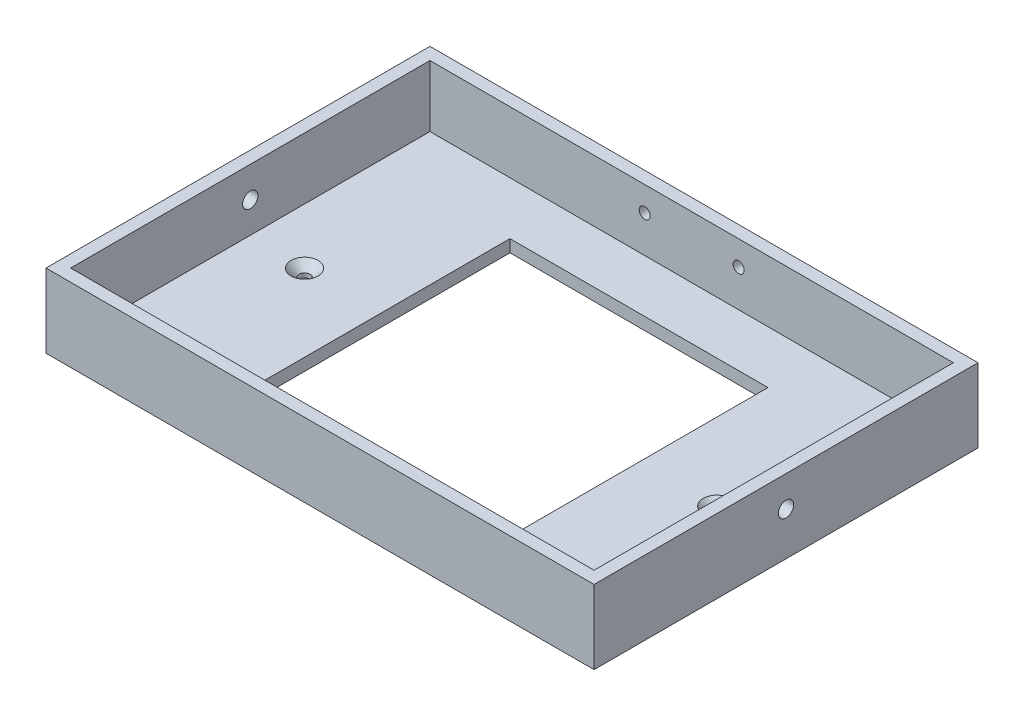
ISO-10303-21;
HEADER;
FILE_DESCRIPTION(('STEP AP214'),'2;1');
FILE_NAME('part.step','',(''),(''),'','','');
FILE_SCHEMA(('AUTOMOTIVE_DESIGN { 1 0 10303 214 1 1 1 1 }'));
ENDSEC;
DATA;
#1=APPLICATION_CONTEXT('core data for automotive mechanical design processes');
#2=APPLICATION_PROTOCOL_DEFINITION('international standard','automotive_design',2000,#1);
#3=PRODUCT_CONTEXT('',#1,'mechanical');
#4=PRODUCT('Part','Part','',(#3));
#5=PRODUCT_RELATED_PRODUCT_CATEGORY('part','',(#4));
#6=PRODUCT_DEFINITION_FORMATION('','',#4);
#7=PRODUCT_DEFINITION_CONTEXT('part definition',#1,'design');
#8=PRODUCT_DEFINITION('design','',#6,#7);
#9=PRODUCT_DEFINITION_SHAPE('','',#8);
#10=(LENGTH_UNIT() NAMED_UNIT(*) SI_UNIT(.MILLI.,.METRE.));
#11=(NAMED_UNIT(*) PLANE_ANGLE_UNIT() SI_UNIT($,.RADIAN.));
#12=(NAMED_UNIT(*) SI_UNIT($,.STERADIAN.) SOLID_ANGLE_UNIT());
#13=UNCERTAINTY_MEASURE_WITH_UNIT(LENGTH_MEASURE(1.E-05),#10,'distance_accuracy_value','');
#14=(GEOMETRIC_REPRESENTATION_CONTEXT(3) GLOBAL_UNCERTAINTY_ASSIGNED_CONTEXT((#13)) GLOBAL_UNIT_ASSIGNED_CONTEXT((#10,
#11,#12)) REPRESENTATION_CONTEXT('',''));
#15=CARTESIAN_POINT('',(0.,0.,0.));
#16=DIRECTION('',(0.,0.,1.));
#17=DIRECTION('',(1.,0.,0.));
#18=AXIS2_PLACEMENT_3D('',#15,#16,#17);
#19=CARTESIAN_POINT('',(-44.545,-2.,0.));
#20=DIRECTION('',(1.,0.,0.));
#21=DIRECTION('',(0.,0.,-1.));
#22=AXIS2_PLACEMENT_3D('',#19,#20,#21);
#23=PLANE('',#22);
#24=CARTESIAN_POINT('',(-44.545,5.,0.));
#25=DIRECTION('',(1.,0.,0.));
#26=DIRECTION('',(0.,0.,-1.));
#27=AXIS2_PLACEMENT_3D('',#24,#25,#26);
#28=CIRCLE('',#27,1.25);
#29=CARTESIAN_POINT('',(-44.545,5.,-1.25));
#30=VERTEX_POINT('',#29);
#31=EDGE_CURVE('E296',#30,#30,#28,.T.);
#32=ORIENTED_EDGE('',*,*,#31,.T.);
#33=EDGE_LOOP('',(#32));
#34=FACE_BOUND('',#33,.T.);
#35=DIRECTION('',(0.,1.,0.));
#36=VECTOR('',#35,1.);
#37=CARTESIAN_POINT('',(-44.545,-2.,31.21));
#38=LINE('',#37,#36);
#39=CARTESIAN_POINT('',(-44.545,-2.,31.21));
#40=VERTEX_POINT('',#39);
#41=CARTESIAN_POINT('',(-44.545,10.,31.21));
#42=VERTEX_POINT('',#41);
#43=EDGE_CURVE('E218',#40,#42,#38,.T.);
#44=ORIENTED_EDGE('',*,*,#43,.T.);
#45=DIRECTION('',(0.,0.,1.));
#46=VECTOR('',#45,1.);
#47=CARTESIAN_POINT('',(-44.545,10.,31.21));
#48=LINE('',#47,#46);
#49=CARTESIAN_POINT('',(-44.545,10.,-31.21));
#50=VERTEX_POINT('',#49);
#51=EDGE_CURVE('E205',#50,#42,#48,.T.);
#52=ORIENTED_EDGE('',*,*,#51,.F.);
#53=DIRECTION('',(0.,1.,0.));
#54=VECTOR('',#53,1.);
#55=CARTESIAN_POINT('',(-44.545,-2.,-31.21));
#56=LINE('',#55,#54);
#57=CARTESIAN_POINT('',(-44.545,-2.,-31.21));
#58=VERTEX_POINT('',#57);
#59=EDGE_CURVE('E12',#58,#50,#56,.T.);
#60=ORIENTED_EDGE('',*,*,#59,.F.);
#61=DIRECTION('',(0.,0.,-1.));
#62=VECTOR('',#61,1.);
#63=CARTESIAN_POINT('',(-44.545,-2.,0.));
#64=LINE('',#63,#62);
#65=EDGE_CURVE('E208',#40,#58,#64,.T.);
#66=ORIENTED_EDGE('',*,*,#65,.F.);
#67=EDGE_LOOP('',(#44,#52,#60,#66));
#68=FACE_BOUND('',#67,.T.);
#69=ADVANCED_FACE('F41',(#34,#68),#23,.F.);
#70=CARTESIAN_POINT('',(0.,-2.,-31.21));
#71=DIRECTION('',(0.,0.,1.));
#72=DIRECTION('',(1.,0.,0.));
#73=AXIS2_PLACEMENT_3D('',#70,#71,#72);
#74=PLANE('',#73);
#75=CARTESIAN_POINT('',(7.635,6.,-31.21));
#76=DIRECTION('',(0.,0.,-1.));
#77=DIRECTION('',(-1.,0.,0.));
#78=AXIS2_PLACEMENT_3D('',#75,#76,#77);
#79=CIRCLE('',#78,0.899999999999999);
#80=CARTESIAN_POINT('',(6.735,6.,-31.21));
#81=VERTEX_POINT('',#80);
#82=EDGE_CURVE('E343',#81,#81,#79,.T.);
#83=ORIENTED_EDGE('',*,*,#82,.F.);
#84=EDGE_LOOP('',(#83));
#85=FACE_BOUND('',#84,.T.);
#86=CARTESIAN_POINT('',(-7.635,6.,-31.21));
#87=DIRECTION('',(0.,0.,-1.));
#88=DIRECTION('',(-1.,0.,0.));
#89=AXIS2_PLACEMENT_3D('',#86,#87,#88);
#90=CIRCLE('',#89,0.899999999999999);
#91=CARTESIAN_POINT('',(-8.535,6.,-31.21));
#92=VERTEX_POINT('',#91);
#93=EDGE_CURVE('E344',#92,#92,#90,.T.);
#94=ORIENTED_EDGE('',*,*,#93,.F.);
#95=EDGE_LOOP('',(#94));
#96=FACE_BOUND('',#95,.T.);
#97=ORIENTED_EDGE('',*,*,#59,.T.);
#98=DIRECTION('',(-1.,0.,0.));
#99=VECTOR('',#98,1.);
#100=CARTESIAN_POINT('',(-44.545,10.,-31.21));
#101=LINE('',#100,#99);
#102=CARTESIAN_POINT('',(44.545,10.,-31.21));
#103=VERTEX_POINT('',#102);
#104=EDGE_CURVE('E202',#103,#50,#101,.T.);
#105=ORIENTED_EDGE('',*,*,#104,.F.);
#106=DIRECTION('',(0.,1.,0.));
#107=VECTOR('',#106,1.);
#108=CARTESIAN_POINT('',(44.545,-2.,-31.21));
#109=LINE('',#108,#107);
#110=CARTESIAN_POINT('',(44.545,-2.,-31.21));
#111=VERTEX_POINT('',#110);
#112=EDGE_CURVE('E49',#111,#103,#109,.T.);
#113=ORIENTED_EDGE('',*,*,#112,.F.);
#114=DIRECTION('',(1.,0.,0.));
#115=VECTOR('',#114,1.);
#116=CARTESIAN_POINT('',(0.,-2.,-31.21));
#117=LINE('',#116,#115);
#118=EDGE_CURVE('E217',#58,#111,#117,.T.);
#119=ORIENTED_EDGE('',*,*,#118,.F.);
#120=EDGE_LOOP('',(#97,#105,#113,#119));
#121=FACE_BOUND('',#120,.T.);
#122=ADVANCED_FACE('F285',(#85,#96,#121),#74,.F.);
#123=CARTESIAN_POINT('',(44.545,-2.,0.));
#124=DIRECTION('',(1.,0.,0.));
#125=DIRECTION('',(0.,0.,-1.));
#126=AXIS2_PLACEMENT_3D('',#123,#124,#125);
#127=PLANE('',#126);
#128=CARTESIAN_POINT('',(44.545,5.,0.));
#129=DIRECTION('',(1.,0.,0.));
#130=DIRECTION('',(0.,0.,-1.));
#131=AXIS2_PLACEMENT_3D('',#128,#129,#130);
#132=CIRCLE('',#131,1.25);
#133=CARTESIAN_POINT('',(44.545,5.,-1.25));
#134=VERTEX_POINT('',#133);
#135=EDGE_CURVE('E332',#134,#134,#132,.T.);
#136=ORIENTED_EDGE('',*,*,#135,.F.);
#137=EDGE_LOOP('',(#136));
#138=FACE_BOUND('',#137,.T.);
#139=ORIENTED_EDGE('',*,*,#112,.T.);
#140=DIRECTION('',(0.,0.,-1.));
#141=VECTOR('',#140,1.);
#142=CARTESIAN_POINT('',(44.545,10.,31.21));
#143=LINE('',#142,#141);
#144=CARTESIAN_POINT('',(44.545,10.,31.21));
#145=VERTEX_POINT('',#144);
#146=EDGE_CURVE('E199',#145,#103,#143,.T.);
#147=ORIENTED_EDGE('',*,*,#146,.F.);
#148=DIRECTION('',(0.,1.,0.));
#149=VECTOR('',#148,1.);
#150=CARTESIAN_POINT('',(44.545,-2.,31.21));
#151=LINE('',#150,#149);
#152=CARTESIAN_POINT('',(44.545,-2.,31.21));
#153=VERTEX_POINT('',#152);
#154=EDGE_CURVE('E220',#153,#145,#151,.T.);
#155=ORIENTED_EDGE('',*,*,#154,.F.);
#156=DIRECTION('',(0.,0.,-1.));
#157=VECTOR('',#156,1.);
#158=CARTESIAN_POINT('',(44.545,-2.,0.));
#159=LINE('',#158,#157);
#160=EDGE_CURVE('E214',#153,#111,#159,.T.);
#161=ORIENTED_EDGE('',*,*,#160,.T.);
#162=EDGE_LOOP('',(#139,#147,#155,#161));
#163=FACE_BOUND('',#162,.T.);
#164=ADVANCED_FACE('F290',(#138,#163),#127,.T.);
#165=CARTESIAN_POINT('',(0.,-2.,31.21));
#166=DIRECTION('',(0.,0.,1.));
#167=DIRECTION('',(1.,0.,0.));
#168=AXIS2_PLACEMENT_3D('',#165,#166,#167);
#169=PLANE('',#168);
#170=ORIENTED_EDGE('',*,*,#154,.T.);
#171=DIRECTION('',(1.,0.,0.));
#172=VECTOR('',#171,1.);
#173=CARTESIAN_POINT('',(-44.545,10.,31.21));
#174=LINE('',#173,#172);
#175=EDGE_CURVE('E196',#42,#145,#174,.T.);
#176=ORIENTED_EDGE('',*,*,#175,.F.);
#177=ORIENTED_EDGE('',*,*,#43,.F.);
#178=DIRECTION('',(1.,0.,0.));
#179=VECTOR('',#178,1.);
#180=CARTESIAN_POINT('',(0.,-2.,31.21));
#181=LINE('',#180,#179);
#182=EDGE_CURVE('E211',#40,#153,#181,.T.);
#183=ORIENTED_EDGE('',*,*,#182,.T.);
#184=EDGE_LOOP('',(#170,#176,#177,#183));
#185=FACE_BOUND('',#184,.T.);
#186=ADVANCED_FACE('F305',(#185),#169,.T.);
#187=CARTESIAN_POINT('',(0.,-2.,0.));
#188=DIRECTION('',(0.,1.,0.));
#189=DIRECTION('',(0.,0.,1.));
#190=AXIS2_PLACEMENT_3D('',#187,#188,#189);
#191=PLANE('',#190);
#192=DIRECTION('',(1.,0.,0.));
#193=VECTOR('',#192,1.);
#194=CARTESIAN_POINT('',(0.,-2.,20.6397148624546));
#195=LINE('',#194,#193);
#196=CARTESIAN_POINT('',(-20.9675803435516,-2.,20.6397148624546));
#197=VERTEX_POINT('',#196);
#198=CARTESIAN_POINT('',(20.9675803435516,-2.,20.6397148624546));
#199=VERTEX_POINT('',#198);
#200=EDGE_CURVE('E554',#197,#199,#195,.T.);
#201=ORIENTED_EDGE('',*,*,#200,.T.);
#202=DIRECTION('',(0.,0.,-1.));
#203=VECTOR('',#202,1.);
#204=CARTESIAN_POINT('',(20.9675803435516,-2.,0.));
#205=LINE('',#204,#203);
#206=CARTESIAN_POINT('',(20.9675803435516,-2.,-20.6397148624546));
#207=VERTEX_POINT('',#206);
#208=EDGE_CURVE('E240',#199,#207,#205,.T.);
#209=ORIENTED_EDGE('',*,*,#208,.T.);
#210=DIRECTION('',(-1.,0.,0.));
#211=VECTOR('',#210,1.);
#212=CARTESIAN_POINT('',(0.,-2.,-20.6397148624546));
#213=LINE('',#212,#211);
#214=CARTESIAN_POINT('',(-20.9675803435516,-2.,-20.6397148624546));
#215=VERTEX_POINT('',#214);
#216=EDGE_CURVE('E156',#207,#215,#213,.T.);
#217=ORIENTED_EDGE('',*,*,#216,.T.);
#218=DIRECTION('',(0.,0.,1.));
#219=VECTOR('',#218,1.);
#220=CARTESIAN_POINT('',(-20.9675803435516,-2.,0.));
#221=LINE('',#220,#219);
#222=EDGE_CURVE('E136',#215,#197,#221,.T.);
#223=ORIENTED_EDGE('',*,*,#222,.T.);
#224=EDGE_LOOP('',(#201,#209,#217,#223));
#225=FACE_BOUND('',#224,.T.);
#226=CARTESIAN_POINT('',(-33.5,-2.,0.218926060152494));
#227=DIRECTION('',(0.,1.,0.));
#228=DIRECTION('',(0.,0.,1.));
#229=AXIS2_PLACEMENT_3D('',#226,#227,#228);
#230=CIRCLE('',#229,0.899999999999995);
#231=CARTESIAN_POINT('',(-33.5,-2.,1.11892606015249));
#232=VERTEX_POINT('',#231);
#233=EDGE_CURVE('E226',#232,#232,#230,.T.);
#234=ORIENTED_EDGE('',*,*,#233,.T.);
#235=EDGE_LOOP('',(#234));
#236=FACE_BOUND('',#235,.T.);
#237=CARTESIAN_POINT('',(33.5,-2.,0.218926060152494));
#238=DIRECTION('',(0.,1.,0.));
#239=DIRECTION('',(0.,0.,1.));
#240=AXIS2_PLACEMENT_3D('',#237,#238,#239);
#241=CIRCLE('',#240,0.899999999999995);
#242=CARTESIAN_POINT('',(33.5,-2.,1.11892606015249));
#243=VERTEX_POINT('',#242);
#244=EDGE_CURVE('E178',#243,#243,#241,.T.);
#245=ORIENTED_EDGE('',*,*,#244,.T.);
#246=EDGE_LOOP('',(#245));
#247=FACE_BOUND('',#246,.T.);
#248=ORIENTED_EDGE('',*,*,#65,.T.);
#249=ORIENTED_EDGE('',*,*,#118,.T.);
#250=ORIENTED_EDGE('',*,*,#160,.F.);
#251=ORIENTED_EDGE('',*,*,#182,.F.);
#252=EDGE_LOOP('',(#248,#249,#250,#251));
#253=FACE_BOUND('',#252,.T.);
#254=ADVANCED_FACE('F312',(#225,#236,#247,#253),#191,.F.);
#255=CARTESIAN_POINT('',(0.,10.,0.));
#256=DIRECTION('',(0.,1.,0.));
#257=DIRECTION('',(0.,0.,1.));
#258=AXIS2_PLACEMENT_3D('',#255,#256,#257);
#259=PLANE('',#258);
#260=ORIENTED_EDGE('',*,*,#175,.T.);
#261=ORIENTED_EDGE('',*,*,#146,.T.);
#262=ORIENTED_EDGE('',*,*,#104,.T.);
#263=ORIENTED_EDGE('',*,*,#51,.T.);
#264=EDGE_LOOP('',(#260,#261,#262,#263));
#265=FACE_BOUND('',#264,.T.);
#266=DIRECTION('',(-1.,0.,0.));
#267=VECTOR('',#266,1.);
#268=CARTESIAN_POINT('',(-42.545,10.,-29.21));
#269=LINE('',#268,#267);
#270=CARTESIAN_POINT('',(42.545,10.,-29.21));
#271=VERTEX_POINT('',#270);
#272=CARTESIAN_POINT('',(-42.545,10.,-29.21));
#273=VERTEX_POINT('',#272);
#274=EDGE_CURVE('E246',#271,#273,#269,.T.);
#275=ORIENTED_EDGE('',*,*,#274,.F.);
#276=DIRECTION('',(0.,0.,-1.));
#277=VECTOR('',#276,1.);
#278=CARTESIAN_POINT('',(42.545,10.,29.21));
#279=LINE('',#278,#277);
#280=CARTESIAN_POINT('',(42.545,10.,29.21));
#281=VERTEX_POINT('',#280);
#282=EDGE_CURVE('E184',#281,#271,#279,.T.);
#283=ORIENTED_EDGE('',*,*,#282,.F.);
#284=DIRECTION('',(1.,0.,0.));
#285=VECTOR('',#284,1.);
#286=CARTESIAN_POINT('',(-42.545,10.,29.21));
#287=LINE('',#286,#285);
#288=CARTESIAN_POINT('',(-42.545,10.,29.21));
#289=VERTEX_POINT('',#288);
#290=EDGE_CURVE('E167',#289,#281,#287,.T.);
#291=ORIENTED_EDGE('',*,*,#290,.F.);
#292=DIRECTION('',(0.,0.,1.));
#293=VECTOR('',#292,1.);
#294=CARTESIAN_POINT('',(-42.545,10.,29.21));
#295=LINE('',#294,#293);
#296=EDGE_CURVE('E172',#273,#289,#295,.T.);
#297=ORIENTED_EDGE('',*,*,#296,.F.);
#298=EDGE_LOOP('',(#275,#283,#291,#297));
#299=FACE_BOUND('',#298,.T.);
#300=ADVANCED_FACE('F261',(#265,#299),#259,.T.);
#301=CARTESIAN_POINT('',(42.545,10.,29.21));
#302=DIRECTION('',(-1.,0.,0.));
#303=DIRECTION('',(0.,0.,1.));
#304=AXIS2_PLACEMENT_3D('',#301,#302,#303);
#305=PLANE('',#304);
#306=CARTESIAN_POINT('',(42.545,5.,0.));
#307=DIRECTION('',(-1.,0.,0.));
#308=DIRECTION('',(0.,0.,1.));
#309=AXIS2_PLACEMENT_3D('',#306,#307,#308);
#310=CIRCLE('',#309,1.25);
#311=CARTESIAN_POINT('',(42.545,5.,1.25));
#312=VERTEX_POINT('',#311);
#313=EDGE_CURVE('E337',#312,#312,#310,.T.);
#314=ORIENTED_EDGE('',*,*,#313,.F.);
#315=EDGE_LOOP('',(#314));
#316=FACE_BOUND('',#315,.T.);
#317=DIRECTION('',(0.,0.,-1.));
#318=VECTOR('',#317,1.);
#319=CARTESIAN_POINT('',(42.545,0.,29.21));
#320=LINE('',#319,#318);
#321=CARTESIAN_POINT('',(42.545,0.,29.21));
#322=VERTEX_POINT('',#321);
#323=CARTESIAN_POINT('',(42.545,0.,-29.21));
#324=VERTEX_POINT('',#323);
#325=EDGE_CURVE('E175',#322,#324,#320,.T.);
#326=ORIENTED_EDGE('',*,*,#325,.F.);
#327=DIRECTION('',(0.,-1.,0.));
#328=VECTOR('',#327,1.);
#329=CARTESIAN_POINT('',(42.545,10.,29.21));
#330=LINE('',#329,#328);
#331=EDGE_CURVE('E171',#281,#322,#330,.T.);
#332=ORIENTED_EDGE('',*,*,#331,.F.);
#333=ORIENTED_EDGE('',*,*,#282,.T.);
#334=DIRECTION('',(0.,-1.,0.));
#335=VECTOR('',#334,1.);
#336=CARTESIAN_POINT('',(42.545,10.,-29.21));
#337=LINE('',#336,#335);
#338=EDGE_CURVE('E193',#271,#324,#337,.T.);
#339=ORIENTED_EDGE('',*,*,#338,.T.);
#340=EDGE_LOOP('',(#326,#332,#333,#339));
#341=FACE_BOUND('',#340,.T.);
#342=ADVANCED_FACE('F267',(#316,#341),#305,.T.);
#343=CARTESIAN_POINT('',(-42.545,10.,-29.21));
#344=DIRECTION('',(0.,0.,1.));
#345=DIRECTION('',(1.,0.,0.));
#346=AXIS2_PLACEMENT_3D('',#343,#344,#345);
#347=PLANE('',#346);
#348=CARTESIAN_POINT('',(7.635,6.,-29.21));
#349=DIRECTION('',(0.,0.,1.));
#350=DIRECTION('',(1.,0.,0.));
#351=AXIS2_PLACEMENT_3D('',#348,#349,#350);
#352=CIRCLE('',#351,0.899999999999999);
#353=CARTESIAN_POINT('',(8.535,6.,-29.21));
#354=VERTEX_POINT('',#353);
#355=EDGE_CURVE('E341',#354,#354,#352,.F.);
#356=ORIENTED_EDGE('',*,*,#355,.T.);
#357=EDGE_LOOP('',(#356));
#358=FACE_BOUND('',#357,.T.);
#359=CARTESIAN_POINT('',(-7.635,6.,-29.21));
#360=DIRECTION('',(0.,0.,1.));
#361=DIRECTION('',(1.,0.,0.));
#362=AXIS2_PLACEMENT_3D('',#359,#360,#361);
#363=CIRCLE('',#362,0.899999999999999);
#364=CARTESIAN_POINT('',(-6.735,6.,-29.21));
#365=VERTEX_POINT('',#364);
#366=EDGE_CURVE('E340',#365,#365,#363,.F.);
#367=ORIENTED_EDGE('',*,*,#366,.T.);
#368=EDGE_LOOP('',(#367));
#369=FACE_BOUND('',#368,.T.);
#370=DIRECTION('',(-1.,0.,0.));
#371=VECTOR('',#370,1.);
#372=CARTESIAN_POINT('',(-42.545,0.,-29.21));
#373=LINE('',#372,#371);
#374=CARTESIAN_POINT('',(-42.545,0.,-29.21));
#375=VERTEX_POINT('',#374);
#376=EDGE_CURVE('E177',#324,#375,#373,.T.);
#377=ORIENTED_EDGE('',*,*,#376,.F.);
#378=ORIENTED_EDGE('',*,*,#338,.F.);
#379=ORIENTED_EDGE('',*,*,#274,.T.);
#380=DIRECTION('',(0.,-1.,0.));
#381=VECTOR('',#380,1.);
#382=CARTESIAN_POINT('',(-42.545,10.,-29.21));
#383=LINE('',#382,#381);
#384=EDGE_CURVE('E190',#273,#375,#383,.T.);
#385=ORIENTED_EDGE('',*,*,#384,.T.);
#386=EDGE_LOOP('',(#377,#378,#379,#385));
#387=FACE_BOUND('',#386,.T.);
#388=ADVANCED_FACE('F270',(#358,#369,#387),#347,.T.);
#389=CARTESIAN_POINT('',(-42.545,10.,29.21));
#390=DIRECTION('',(1.,0.,0.));
#391=DIRECTION('',(0.,0.,-1.));
#392=AXIS2_PLACEMENT_3D('',#389,#390,#391);
#393=PLANE('',#392);
#394=CARTESIAN_POINT('',(-42.545,5.,0.));
#395=DIRECTION('',(1.,0.,0.));
#396=DIRECTION('',(0.,0.,-1.));
#397=AXIS2_PLACEMENT_3D('',#394,#395,#396);
#398=CIRCLE('',#397,1.25);
#399=CARTESIAN_POINT('',(-42.545,5.,-1.25));
#400=VERTEX_POINT('',#399);
#401=EDGE_CURVE('E44',#400,#400,#398,.T.);
#402=ORIENTED_EDGE('',*,*,#401,.F.);
#403=EDGE_LOOP('',(#402));
#404=FACE_BOUND('',#403,.T.);
#405=DIRECTION('',(0.,0.,1.));
#406=VECTOR('',#405,1.);
#407=CARTESIAN_POINT('',(-42.545,0.,29.21));
#408=LINE('',#407,#406);
#409=CARTESIAN_POINT('',(-42.545,0.,29.21));
#410=VERTEX_POINT('',#409);
#411=EDGE_CURVE('E180',#375,#410,#408,.T.);
#412=ORIENTED_EDGE('',*,*,#411,.F.);
#413=ORIENTED_EDGE('',*,*,#384,.F.);
#414=ORIENTED_EDGE('',*,*,#296,.T.);
#415=DIRECTION('',(0.,-1.,0.));
#416=VECTOR('',#415,1.);
#417=CARTESIAN_POINT('',(-42.545,10.,29.21));
#418=LINE('',#417,#416);
#419=EDGE_CURVE('E187',#289,#410,#418,.T.);
#420=ORIENTED_EDGE('',*,*,#419,.T.);
#421=EDGE_LOOP('',(#412,#413,#414,#420));
#422=FACE_BOUND('',#421,.T.);
#423=ADVANCED_FACE('F257',(#404,#422),#393,.T.);
#424=CARTESIAN_POINT('',(-42.545,10.,29.21));
#425=DIRECTION('',(0.,0.,-1.));
#426=DIRECTION('',(-1.,0.,0.));
#427=AXIS2_PLACEMENT_3D('',#424,#425,#426);
#428=PLANE('',#427);
#429=DIRECTION('',(1.,0.,0.));
#430=VECTOR('',#429,1.);
#431=CARTESIAN_POINT('',(-42.545,0.,29.21));
#432=LINE('',#431,#430);
#433=EDGE_CURVE('E182',#410,#322,#432,.T.);
#434=ORIENTED_EDGE('',*,*,#433,.F.);
#435=ORIENTED_EDGE('',*,*,#419,.F.);
#436=ORIENTED_EDGE('',*,*,#290,.T.);
#437=ORIENTED_EDGE('',*,*,#331,.T.);
#438=EDGE_LOOP('',(#434,#435,#436,#437));
#439=FACE_BOUND('',#438,.T.);
#440=ADVANCED_FACE('F264',(#439),#428,.T.);
#441=CARTESIAN_POINT('',(0.,0.,0.));
#442=DIRECTION('',(0.,1.,0.));
#443=DIRECTION('',(0.,0.,1.));
#444=AXIS2_PLACEMENT_3D('',#441,#442,#443);
#445=PLANE('',#444);
#446=DIRECTION('',(0.,0.,-1.));
#447=VECTOR('',#446,1.);
#448=CARTESIAN_POINT('',(20.9675803435516,0.,20.6397148624546));
#449=LINE('',#448,#447);
#450=CARTESIAN_POINT('',(20.9675803435516,0.,20.6397148624546));
#451=VERTEX_POINT('',#450);
#452=CARTESIAN_POINT('',(20.9675803435516,0.,-20.6397148624546));
#453=VERTEX_POINT('',#452);
#454=EDGE_CURVE('E65',#451,#453,#449,.T.);
#455=ORIENTED_EDGE('',*,*,#454,.F.);
#456=DIRECTION('',(1.,0.,0.));
#457=VECTOR('',#456,1.);
#458=CARTESIAN_POINT('',(-20.9675803435516,0.,20.6397148624546));
#459=LINE('',#458,#457);
#460=CARTESIAN_POINT('',(-20.9675803435516,0.,20.6397148624546));
#461=VERTEX_POINT('',#460);
#462=EDGE_CURVE('E149',#461,#451,#459,.T.);
#463=ORIENTED_EDGE('',*,*,#462,.F.);
#464=DIRECTION('',(0.,0.,1.));
#465=VECTOR('',#464,1.);
#466=CARTESIAN_POINT('',(-20.9675803435516,0.,20.6397148624546));
#467=LINE('',#466,#465);
#468=CARTESIAN_POINT('',(-20.9675803435516,0.,-20.6397148624546));
#469=VERTEX_POINT('',#468);
#470=EDGE_CURVE('E133',#469,#461,#467,.T.);
#471=ORIENTED_EDGE('',*,*,#470,.F.);
#472=DIRECTION('',(-1.,0.,0.));
#473=VECTOR('',#472,1.);
#474=CARTESIAN_POINT('',(-20.9675803435516,0.,-20.6397148624546));
#475=LINE('',#474,#473);
#476=EDGE_CURVE('E142',#453,#469,#475,.T.);
#477=ORIENTED_EDGE('',*,*,#476,.F.);
#478=EDGE_LOOP('',(#455,#463,#471,#477));
#479=FACE_BOUND('',#478,.T.);
#480=CARTESIAN_POINT('',(-33.5,0.,0.218926060152494));
#481=DIRECTION('',(0.,1.,0.));
#482=DIRECTION('',(0.,0.,1.));
#483=AXIS2_PLACEMENT_3D('',#480,#481,#482);
#484=CIRCLE('',#483,2.2);
#485=CARTESIAN_POINT('',(-33.5,0.,2.41892606015249));
#486=VERTEX_POINT('',#485);
#487=EDGE_CURVE('E235',#486,#486,#484,.T.);
#488=ORIENTED_EDGE('',*,*,#487,.F.);
#489=EDGE_LOOP('',(#488));
#490=FACE_BOUND('',#489,.T.);
#491=CARTESIAN_POINT('',(33.5,0.,0.218926060152494));
#492=DIRECTION('',(0.,1.,0.));
#493=DIRECTION('',(0.,0.,1.));
#494=AXIS2_PLACEMENT_3D('',#491,#492,#493);
#495=CIRCLE('',#494,2.2);
#496=CARTESIAN_POINT('',(33.5,0.,2.41892606015249));
#497=VERTEX_POINT('',#496);
#498=EDGE_CURVE('E228',#497,#497,#495,.T.);
#499=ORIENTED_EDGE('',*,*,#498,.F.);
#500=EDGE_LOOP('',(#499));
#501=FACE_BOUND('',#500,.T.);
#502=ORIENTED_EDGE('',*,*,#325,.T.);
#503=ORIENTED_EDGE('',*,*,#376,.T.);
#504=ORIENTED_EDGE('',*,*,#411,.T.);
#505=ORIENTED_EDGE('',*,*,#433,.T.);
#506=EDGE_LOOP('',(#502,#503,#504,#505));
#507=FACE_BOUND('',#506,.T.);
#508=ADVANCED_FACE('F146',(#479,#490,#501,#507),#445,.T.);
#509=CARTESIAN_POINT('',(33.5,0.,0.218926060152494));
#510=DIRECTION('',(0.,1.,0.));
#511=DIRECTION('',(0.,0.,1.));
#512=AXIS2_PLACEMENT_3D('',#509,#510,#511);
#513=CYLINDRICAL_SURFACE('',#512,0.899999999999995);
#514=CARTESIAN_POINT('',(33.5,-1.30000000000001,0.218926060152494));
#515=DIRECTION('',(0.,1.,0.));
#516=DIRECTION('',(0.,0.,1.));
#517=AXIS2_PLACEMENT_3D('',#514,#515,#516);
#518=CIRCLE('',#517,0.899999999999991);
#519=CARTESIAN_POINT('',(33.5,-1.30000000000001,1.11892606015248));
#520=VERTEX_POINT('',#519);
#521=EDGE_CURVE('E225',#520,#520,#518,.T.);
#522=ORIENTED_EDGE('',*,*,#521,.T.);
#523=EDGE_LOOP('',(#522));
#524=FACE_BOUND('',#523,.T.);
#525=ORIENTED_EDGE('',*,*,#244,.F.);
#526=EDGE_LOOP('',(#525));
#527=FACE_BOUND('',#526,.T.);
#528=ADVANCED_FACE('F324',(#524,#527),#513,.F.);
#529=CARTESIAN_POINT('',(33.5,0.,0.218926060152494));
#530=DIRECTION('',(0.,1.,0.));
#531=DIRECTION('',(0.,0.,1.));
#532=AXIS2_PLACEMENT_3D('',#529,#530,#531);
#533=CONICAL_SURFACE('',#532,2.2,0.785398163397448);
#534=ORIENTED_EDGE('',*,*,#521,.F.);
#535=EDGE_LOOP('',(#534));
#536=FACE_BOUND('',#535,.T.);
#537=ORIENTED_EDGE('',*,*,#498,.T.);
#538=EDGE_LOOP('',(#537));
#539=FACE_BOUND('',#538,.T.);
#540=ADVANCED_FACE('F385',(#536,#539),#533,.F.);
#541=CARTESIAN_POINT('',(-33.5,0.,0.218926060152494));
#542=DIRECTION('',(0.,1.,0.));
#543=DIRECTION('',(0.,0.,1.));
#544=AXIS2_PLACEMENT_3D('',#541,#542,#543);
#545=CYLINDRICAL_SURFACE('',#544,0.899999999999995);
#546=CARTESIAN_POINT('',(-33.5,-1.30000000000001,0.218926060152494));
#547=DIRECTION('',(0.,1.,0.));
#548=DIRECTION('',(0.,0.,1.));
#549=AXIS2_PLACEMENT_3D('',#546,#547,#548);
#550=CIRCLE('',#549,0.899999999999991);
#551=CARTESIAN_POINT('',(-33.5,-1.30000000000001,1.11892606015248));
#552=VERTEX_POINT('',#551);
#553=EDGE_CURVE('E229',#552,#552,#550,.T.);
#554=ORIENTED_EDGE('',*,*,#553,.T.);
#555=EDGE_LOOP('',(#554));
#556=FACE_BOUND('',#555,.T.);
#557=ORIENTED_EDGE('',*,*,#233,.F.);
#558=EDGE_LOOP('',(#557));
#559=FACE_BOUND('',#558,.T.);
#560=ADVANCED_FACE('F381',(#556,#559),#545,.F.);
#561=CARTESIAN_POINT('',(-33.5,0.,0.218926060152494));
#562=DIRECTION('',(0.,1.,0.));
#563=DIRECTION('',(0.,0.,1.));
#564=AXIS2_PLACEMENT_3D('',#561,#562,#563);
#565=CONICAL_SURFACE('',#564,2.2,0.785398163397448);
#566=ORIENTED_EDGE('',*,*,#553,.F.);
#567=EDGE_LOOP('',(#566));
#568=FACE_BOUND('',#567,.T.);
#569=ORIENTED_EDGE('',*,*,#487,.T.);
#570=EDGE_LOOP('',(#569));
#571=FACE_BOUND('',#570,.T.);
#572=ADVANCED_FACE('F378',(#568,#571),#565,.F.);
#573=CARTESIAN_POINT('',(20.9675803435516,-2.54,20.6397148624546));
#574=DIRECTION('',(1.,0.,0.));
#575=DIRECTION('',(0.,0.,-1.));
#576=AXIS2_PLACEMENT_3D('',#573,#574,#575);
#577=PLANE('',#576);
#578=DIRECTION('',(0.,1.,0.));
#579=VECTOR('',#578,1.);
#580=CARTESIAN_POINT('',(20.9675803435516,-2.54,20.6397148624546));
#581=LINE('',#580,#579);
#582=EDGE_CURVE('E154',#199,#451,#581,.T.);
#583=ORIENTED_EDGE('',*,*,#582,.T.);
#584=ORIENTED_EDGE('',*,*,#454,.T.);
#585=DIRECTION('',(0.,1.,0.));
#586=VECTOR('',#585,1.);
#587=CARTESIAN_POINT('',(20.9675803435516,-2.54,-20.6397148624546));
#588=LINE('',#587,#586);
#589=EDGE_CURVE('E139',#207,#453,#588,.T.);
#590=ORIENTED_EDGE('',*,*,#589,.F.);
#591=ORIENTED_EDGE('',*,*,#208,.F.);
#592=EDGE_LOOP('',(#583,#584,#590,#591));
#593=FACE_BOUND('',#592,.T.);
#594=ADVANCED_FACE('F372',(#593),#577,.F.);
#595=CARTESIAN_POINT('',(-20.9675803435516,-2.54,20.6397148624546));
#596=DIRECTION('',(0.,0.,1.));
#597=DIRECTION('',(1.,0.,0.));
#598=AXIS2_PLACEMENT_3D('',#595,#596,#597);
#599=PLANE('',#598);
#600=DIRECTION('',(0.,1.,0.));
#601=VECTOR('',#600,1.);
#602=CARTESIAN_POINT('',(-20.9675803435516,-2.54,20.6397148624546));
#603=LINE('',#602,#601);
#604=EDGE_CURVE('E138',#197,#461,#603,.T.);
#605=ORIENTED_EDGE('',*,*,#604,.T.);
#606=ORIENTED_EDGE('',*,*,#462,.T.);
#607=ORIENTED_EDGE('',*,*,#582,.F.);
#608=ORIENTED_EDGE('',*,*,#200,.F.);
#609=EDGE_LOOP('',(#605,#606,#607,#608));
#610=FACE_BOUND('',#609,.T.);
#611=ADVANCED_FACE('F369',(#610),#599,.F.);
#612=CARTESIAN_POINT('',(-20.9675803435516,-2.54,20.6397148624546));
#613=DIRECTION('',(-1.,0.,0.));
#614=DIRECTION('',(0.,0.,1.));
#615=AXIS2_PLACEMENT_3D('',#612,#613,#614);
#616=PLANE('',#615);
#617=DIRECTION('',(0.,1.,0.));
#618=VECTOR('',#617,1.);
#619=CARTESIAN_POINT('',(-20.9675803435516,-2.54,-20.6397148624546));
#620=LINE('',#619,#618);
#621=EDGE_CURVE('E57',#215,#469,#620,.T.);
#622=ORIENTED_EDGE('',*,*,#621,.T.);
#623=ORIENTED_EDGE('',*,*,#470,.T.);
#624=ORIENTED_EDGE('',*,*,#604,.F.);
#625=ORIENTED_EDGE('',*,*,#222,.F.);
#626=EDGE_LOOP('',(#622,#623,#624,#625));
#627=FACE_BOUND('',#626,.T.);
#628=ADVANCED_FACE('F130',(#627),#616,.F.);
#629=CARTESIAN_POINT('',(-20.9675803435516,-2.54,-20.6397148624546));
#630=DIRECTION('',(0.,0.,-1.));
#631=DIRECTION('',(-1.,0.,0.));
#632=AXIS2_PLACEMENT_3D('',#629,#630,#631);
#633=PLANE('',#632);
#634=ORIENTED_EDGE('',*,*,#589,.T.);
#635=ORIENTED_EDGE('',*,*,#476,.T.);
#636=ORIENTED_EDGE('',*,*,#621,.F.);
#637=ORIENTED_EDGE('',*,*,#216,.F.);
#638=EDGE_LOOP('',(#634,#635,#636,#637));
#639=FACE_BOUND('',#638,.T.);
#640=ADVANCED_FACE('F143',(#639),#633,.F.);
#641=CARTESIAN_POINT('',(-7.635,6.,31.211));
#642=DIRECTION('',(0.,0.,-1.));
#643=DIRECTION('',(-1.,0.,0.));
#644=AXIS2_PLACEMENT_3D('',#641,#642,#643);
#645=CYLINDRICAL_SURFACE('',#644,0.899999999999999);
#646=ORIENTED_EDGE('',*,*,#366,.F.);
#647=EDGE_LOOP('',(#646));
#648=FACE_BOUND('',#647,.T.);
#649=ORIENTED_EDGE('',*,*,#93,.T.);
#650=EDGE_LOOP('',(#649));
#651=FACE_BOUND('',#650,.T.);
#652=ADVANCED_FACE('F352',(#648,#651),#645,.F.);
#653=CARTESIAN_POINT('',(7.635,6.,31.211));
#654=DIRECTION('',(0.,0.,-1.));
#655=DIRECTION('',(-1.,0.,0.));
#656=AXIS2_PLACEMENT_3D('',#653,#654,#655);
#657=CYLINDRICAL_SURFACE('',#656,0.899999999999999);
#658=ORIENTED_EDGE('',*,*,#355,.F.);
#659=EDGE_LOOP('',(#658));
#660=FACE_BOUND('',#659,.T.);
#661=ORIENTED_EDGE('',*,*,#82,.T.);
#662=EDGE_LOOP('',(#661));
#663=FACE_BOUND('',#662,.T.);
#664=ADVANCED_FACE('F355',(#660,#663),#657,.F.);
#665=CARTESIAN_POINT('',(-44.545,5.,0.));
#666=DIRECTION('',(1.,0.,0.));
#667=DIRECTION('',(0.,0.,-1.));
#668=AXIS2_PLACEMENT_3D('',#665,#666,#667);
#669=CYLINDRICAL_SURFACE('',#668,1.25);
#670=ORIENTED_EDGE('',*,*,#401,.T.);
#671=EDGE_LOOP('',(#670));
#672=FACE_BOUND('',#671,.T.);
#673=ORIENTED_EDGE('',*,*,#31,.F.);
#674=EDGE_LOOP('',(#673));
#675=FACE_BOUND('',#674,.T.);
#676=ADVANCED_FACE('F362',(#672,#675),#669,.F.);
#677=ORIENTED_EDGE('',*,*,#313,.T.);
#678=EDGE_LOOP('',(#677));
#679=FACE_BOUND('',#678,.T.);
#680=ORIENTED_EDGE('',*,*,#135,.T.);
#681=EDGE_LOOP('',(#680));
#682=FACE_BOUND('',#681,.T.);
#683=ADVANCED_FACE('F486',(#679,#682),#669,.F.);
#684=CLOSED_SHELL('',(#69,#122,#164,#186,#254,#300,#342,#388,#423,#440,#508,#528,#540,#560,#572,
#594,#611,#628,#640,#652,#664,#676,#683));
#685=MANIFOLD_SOLID_BREP('B2',#684);
#686=ADVANCED_BREP_SHAPE_REPRESENTATION('',(#18,#685),#14);
#687=SHAPE_DEFINITION_REPRESENTATION(#9,#686);
ENDSEC;
END-ISO-10303-21;
